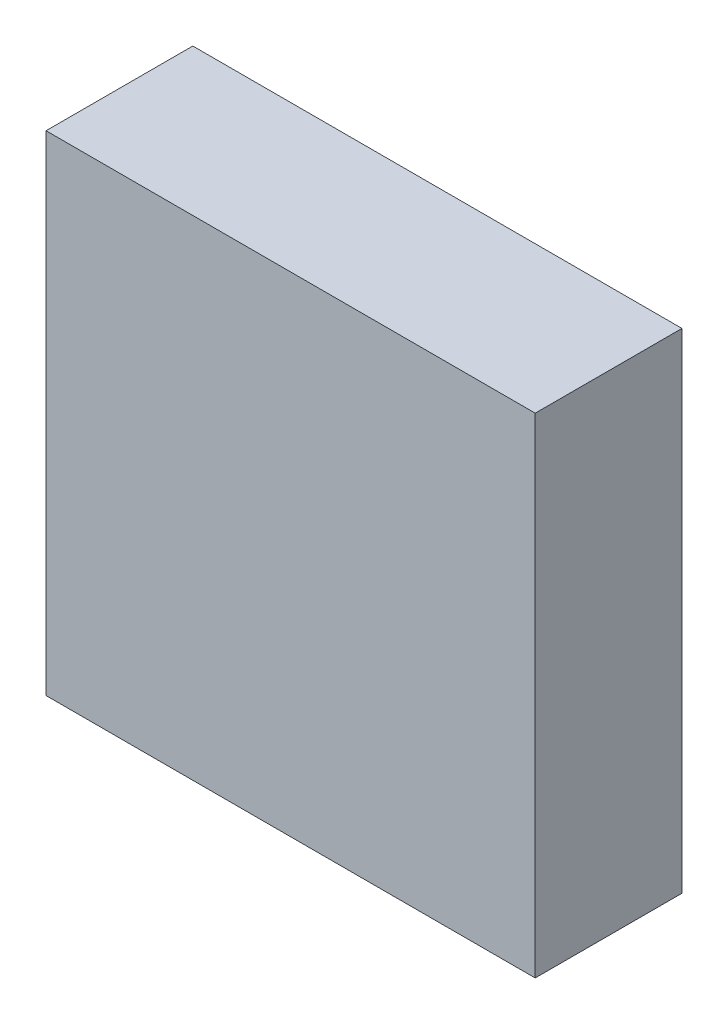
ISO-10303-21;
HEADER;
FILE_DESCRIPTION(('STEP AP214'),'2;1');
FILE_NAME('part.step','',(''),(''),'','','');
FILE_SCHEMA(('AUTOMOTIVE_DESIGN { 1 0 10303 214 1 1 1 1 }'));
ENDSEC;
DATA;
#1=APPLICATION_CONTEXT('core data for automotive mechanical design processes');
#2=APPLICATION_PROTOCOL_DEFINITION('international standard','automotive_design',2000,#1);
#3=PRODUCT_CONTEXT('',#1,'mechanical');
#4=PRODUCT('Part','Part','',(#3));
#5=PRODUCT_RELATED_PRODUCT_CATEGORY('part','',(#4));
#6=PRODUCT_DEFINITION_FORMATION('','',#4);
#7=PRODUCT_DEFINITION_CONTEXT('part definition',#1,'design');
#8=PRODUCT_DEFINITION('design','',#6,#7);
#9=PRODUCT_DEFINITION_SHAPE('','',#8);
#10=(LENGTH_UNIT() NAMED_UNIT(*) SI_UNIT(.MILLI.,.METRE.));
#11=(NAMED_UNIT(*) PLANE_ANGLE_UNIT() SI_UNIT($,.RADIAN.));
#12=(NAMED_UNIT(*) SI_UNIT($,.STERADIAN.) SOLID_ANGLE_UNIT());
#13=UNCERTAINTY_MEASURE_WITH_UNIT(LENGTH_MEASURE(1.E-05),#10,'distance_accuracy_value','');
#14=(GEOMETRIC_REPRESENTATION_CONTEXT(3) GLOBAL_UNCERTAINTY_ASSIGNED_CONTEXT((#13)) GLOBAL_UNIT_ASSIGNED_CONTEXT((#10,
#11,#12)) REPRESENTATION_CONTEXT('',''));
#15=CARTESIAN_POINT('',(0.,0.,0.));
#16=DIRECTION('',(0.,0.,1.));
#17=DIRECTION('',(1.,0.,0.));
#18=AXIS2_PLACEMENT_3D('',#15,#16,#17);
#19=CARTESIAN_POINT('',(-500.,-500.,-400.));
#20=DIRECTION('',(0.,0.,1.));
#21=DIRECTION('',(1.,0.,0.));
#22=AXIS2_PLACEMENT_3D('',#19,#20,#21);
#23=PLANE('',#22);
#24=DIRECTION('',(0.,1.,0.));
#25=VECTOR('',#24,1.);
#26=CARTESIAN_POINT('',(-500.,-500.,-400.));
#27=LINE('',#26,#25);
#28=CARTESIAN_POINT('',(-500.,-500.,-400.));
#29=VERTEX_POINT('',#28);
#30=CARTESIAN_POINT('',(-500.,500.,-400.));
#31=VERTEX_POINT('',#30);
#32=EDGE_CURVE('E88',#29,#31,#27,.T.);
#33=ORIENTED_EDGE('',*,*,#32,.F.);
#34=DIRECTION('',(1.,0.,0.));
#35=VECTOR('',#34,1.);
#36=CARTESIAN_POINT('',(-500.,-500.,-400.));
#37=LINE('',#36,#35);
#38=CARTESIAN_POINT('',(500.,-500.,-400.));
#39=VERTEX_POINT('',#38);
#40=EDGE_CURVE('E71',#29,#39,#37,.T.);
#41=ORIENTED_EDGE('',*,*,#40,.T.);
#42=DIRECTION('',(0.,1.,0.));
#43=VECTOR('',#42,1.);
#44=CARTESIAN_POINT('',(500.,-500.,-400.));
#45=LINE('',#44,#43);
#46=CARTESIAN_POINT('',(500.,500.,-400.));
#47=VERTEX_POINT('',#46);
#48=EDGE_CURVE('E82',#39,#47,#45,.T.);
#49=ORIENTED_EDGE('',*,*,#48,.T.);
#50=DIRECTION('',(1.,0.,0.));
#51=VECTOR('',#50,1.);
#52=CARTESIAN_POINT('',(-500.,500.,-400.));
#53=LINE('',#52,#51);
#54=EDGE_CURVE('E11',#31,#47,#53,.T.);
#55=ORIENTED_EDGE('',*,*,#54,.F.);
#56=EDGE_LOOP('',(#33,#41,#49,#55));
#57=FACE_BOUND('',#56,.T.);
#58=ADVANCED_FACE('F17',(#57),#23,.T.);
#59=CARTESIAN_POINT('',(-500.,-500.,-700.));
#60=DIRECTION('',(0.,0.,1.));
#61=DIRECTION('',(1.,0.,0.));
#62=AXIS2_PLACEMENT_3D('',#59,#60,#61);
#63=PLANE('',#62);
#64=DIRECTION('',(1.,0.,0.));
#65=VECTOR('',#64,1.);
#66=CARTESIAN_POINT('',(-500.,500.,-700.));
#67=LINE('',#66,#65);
#68=CARTESIAN_POINT('',(-500.,500.,-700.));
#69=VERTEX_POINT('',#68);
#70=CARTESIAN_POINT('',(500.,500.,-700.));
#71=VERTEX_POINT('',#70);
#72=EDGE_CURVE('E26',#69,#71,#67,.T.);
#73=ORIENTED_EDGE('',*,*,#72,.T.);
#74=DIRECTION('',(0.,1.,0.));
#75=VECTOR('',#74,1.);
#76=CARTESIAN_POINT('',(500.,-500.,-700.));
#77=LINE('',#76,#75);
#78=CARTESIAN_POINT('',(500.,-500.,-700.));
#79=VERTEX_POINT('',#78);
#80=EDGE_CURVE('E105',#79,#71,#77,.T.);
#81=ORIENTED_EDGE('',*,*,#80,.F.);
#82=DIRECTION('',(1.,0.,0.));
#83=VECTOR('',#82,1.);
#84=CARTESIAN_POINT('',(-500.,-500.,-700.));
#85=LINE('',#84,#83);
#86=CARTESIAN_POINT('',(-500.,-500.,-700.));
#87=VERTEX_POINT('',#86);
#88=EDGE_CURVE('E20',#87,#79,#85,.T.);
#89=ORIENTED_EDGE('',*,*,#88,.F.);
#90=DIRECTION('',(0.,1.,0.));
#91=VECTOR('',#90,1.);
#92=CARTESIAN_POINT('',(-500.,-500.,-700.));
#93=LINE('',#92,#91);
#94=EDGE_CURVE('E89',#87,#69,#93,.T.);
#95=ORIENTED_EDGE('',*,*,#94,.T.);
#96=EDGE_LOOP('',(#73,#81,#89,#95));
#97=FACE_BOUND('',#96,.T.);
#98=ADVANCED_FACE('F118',(#97),#63,.F.);
#99=CARTESIAN_POINT('',(-500.,500.,-700.));
#100=DIRECTION('',(0.,1.,0.));
#101=DIRECTION('',(1.,0.,0.));
#102=AXIS2_PLACEMENT_3D('',#99,#100,#101);
#103=PLANE('',#102);
#104=ORIENTED_EDGE('',*,*,#72,.F.);
#105=DIRECTION('',(0.,0.,1.));
#106=VECTOR('',#105,1.);
#107=CARTESIAN_POINT('',(-500.,500.,-700.));
#108=LINE('',#107,#106);
#109=EDGE_CURVE('E93',#69,#31,#108,.T.);
#110=ORIENTED_EDGE('',*,*,#109,.T.);
#111=ORIENTED_EDGE('',*,*,#54,.T.);
#112=DIRECTION('',(0.,0.,1.));
#113=VECTOR('',#112,1.);
#114=CARTESIAN_POINT('',(500.,500.,-700.));
#115=LINE('',#114,#113);
#116=EDGE_CURVE('E109',#71,#47,#115,.T.);
#117=ORIENTED_EDGE('',*,*,#116,.F.);
#118=EDGE_LOOP('',(#104,#110,#111,#117));
#119=FACE_BOUND('',#118,.T.);
#120=ADVANCED_FACE('F117',(#119),#103,.T.);
#121=CARTESIAN_POINT('',(-500.,-500.,-700.));
#122=DIRECTION('',(0.,1.,0.));
#123=DIRECTION('',(1.,0.,0.));
#124=AXIS2_PLACEMENT_3D('',#121,#122,#123);
#125=PLANE('',#124);
#126=DIRECTION('',(0.,0.,1.));
#127=VECTOR('',#126,1.);
#128=CARTESIAN_POINT('',(500.,-500.,-700.));
#129=LINE('',#128,#127);
#130=EDGE_CURVE('E77',#79,#39,#129,.T.);
#131=ORIENTED_EDGE('',*,*,#130,.T.);
#132=ORIENTED_EDGE('',*,*,#40,.F.);
#133=DIRECTION('',(0.,0.,1.));
#134=VECTOR('',#133,1.);
#135=CARTESIAN_POINT('',(-500.,-500.,-700.));
#136=LINE('',#135,#134);
#137=EDGE_CURVE('E74',#87,#29,#136,.T.);
#138=ORIENTED_EDGE('',*,*,#137,.F.);
#139=ORIENTED_EDGE('',*,*,#88,.T.);
#140=EDGE_LOOP('',(#131,#132,#138,#139));
#141=FACE_BOUND('',#140,.T.);
#142=ADVANCED_FACE('F73',(#141),#125,.F.);
#143=CARTESIAN_POINT('',(500.,-500.,-700.));
#144=DIRECTION('',(1.,0.,0.));
#145=DIRECTION('',(0.,1.,0.));
#146=AXIS2_PLACEMENT_3D('',#143,#144,#145);
#147=PLANE('',#146);
#148=ORIENTED_EDGE('',*,*,#130,.F.);
#149=ORIENTED_EDGE('',*,*,#80,.T.);
#150=ORIENTED_EDGE('',*,*,#116,.T.);
#151=ORIENTED_EDGE('',*,*,#48,.F.);
#152=EDGE_LOOP('',(#148,#149,#150,#151));
#153=FACE_BOUND('',#152,.T.);
#154=ADVANCED_FACE('F116',(#153),#147,.T.);
#155=CARTESIAN_POINT('',(-500.,-500.,-700.));
#156=DIRECTION('',(1.,0.,0.));
#157=DIRECTION('',(0.,1.,0.));
#158=AXIS2_PLACEMENT_3D('',#155,#156,#157);
#159=PLANE('',#158);
#160=ORIENTED_EDGE('',*,*,#32,.T.);
#161=ORIENTED_EDGE('',*,*,#109,.F.);
#162=ORIENTED_EDGE('',*,*,#94,.F.);
#163=ORIENTED_EDGE('',*,*,#137,.T.);
#164=EDGE_LOOP('',(#160,#161,#162,#163));
#165=FACE_BOUND('',#164,.T.);
#166=ADVANCED_FACE('F86',(#165),#159,.F.);
#167=CLOSED_SHELL('',(#58,#98,#120,#142,#154,#166));
#168=MANIFOLD_SOLID_BREP('B1',#167);
#169=ADVANCED_BREP_SHAPE_REPRESENTATION('',(#18,#168),#14);
#170=SHAPE_DEFINITION_REPRESENTATION(#9,#169);
ENDSEC;
END-ISO-10303-21;
